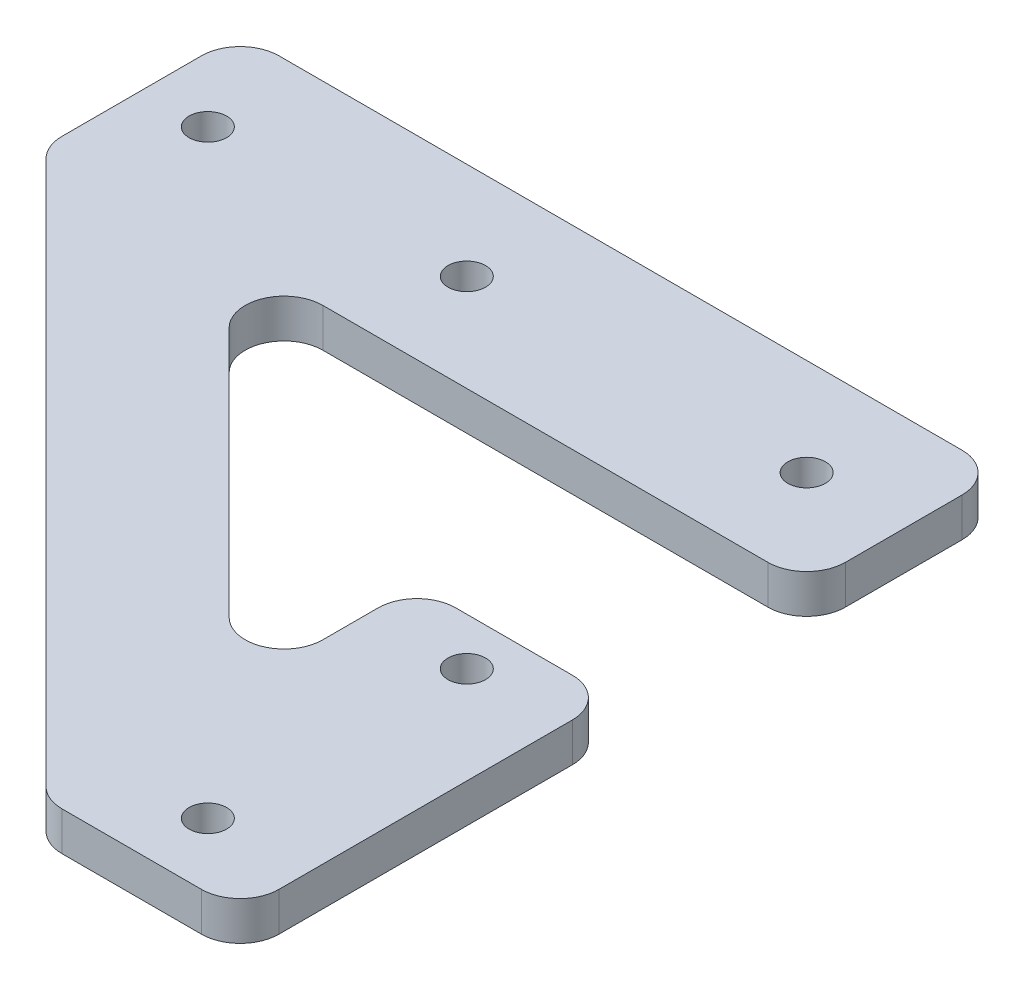
ISO-10303-21;
HEADER;
FILE_DESCRIPTION(('STEP AP214'),'2;1');
FILE_NAME('part.step','',(''),(''),'','','');
FILE_SCHEMA(('AUTOMOTIVE_DESIGN { 1 0 10303 214 1 1 1 1 }'));
ENDSEC;
DATA;
#1=APPLICATION_CONTEXT('core data for automotive mechanical design processes');
#2=APPLICATION_PROTOCOL_DEFINITION('international standard','automotive_design',2000,#1);
#3=PRODUCT_CONTEXT('',#1,'mechanical');
#4=PRODUCT('Part','Part','',(#3));
#5=PRODUCT_RELATED_PRODUCT_CATEGORY('part','',(#4));
#6=PRODUCT_DEFINITION_FORMATION('','',#4);
#7=PRODUCT_DEFINITION_CONTEXT('part definition',#1,'design');
#8=PRODUCT_DEFINITION('design','',#6,#7);
#9=PRODUCT_DEFINITION_SHAPE('','',#8);
#10=(LENGTH_UNIT() NAMED_UNIT(*) SI_UNIT(.MILLI.,.METRE.));
#11=(NAMED_UNIT(*) PLANE_ANGLE_UNIT() SI_UNIT($,.RADIAN.));
#12=(NAMED_UNIT(*) SI_UNIT($,.STERADIAN.) SOLID_ANGLE_UNIT());
#13=UNCERTAINTY_MEASURE_WITH_UNIT(LENGTH_MEASURE(1.E-05),#10,'distance_accuracy_value','');
#14=(GEOMETRIC_REPRESENTATION_CONTEXT(3) GLOBAL_UNCERTAINTY_ASSIGNED_CONTEXT((#13)) GLOBAL_UNIT_ASSIGNED_CONTEXT((#10,
#11,#12)) REPRESENTATION_CONTEXT('',''));
#15=CARTESIAN_POINT('',(0.,0.,0.));
#16=DIRECTION('',(0.,0.,1.));
#17=DIRECTION('',(1.,0.,0.));
#18=AXIS2_PLACEMENT_3D('',#15,#16,#17);
#19=CARTESIAN_POINT('',(0.,3.,0.));
#20=DIRECTION('',(0.,-1.,0.));
#21=DIRECTION('',(0.,0.,-1.));
#22=AXIS2_PLACEMENT_3D('',#19,#20,#21);
#23=PLANE('',#22);
#24=CARTESIAN_POINT('',(-46.25,3.,7.5));
#25=DIRECTION('',(0.,1.,0.));
#26=DIRECTION('',(0.,0.,1.));
#27=AXIS2_PLACEMENT_3D('',#24,#25,#26);
#28=CIRCLE('',#27,1.45);
#29=CARTESIAN_POINT('',(-46.25,3.,8.95));
#30=VERTEX_POINT('',#29);
#31=EDGE_CURVE('E317',#30,#30,#28,.T.);
#32=ORIENTED_EDGE('',*,*,#31,.F.);
#33=EDGE_LOOP('',(#32));
#34=FACE_BOUND('',#33,.T.);
#35=CARTESIAN_POINT('',(-26.25,3.,7.5));
#36=DIRECTION('',(0.,1.,0.));
#37=DIRECTION('',(0.,0.,1.));
#38=AXIS2_PLACEMENT_3D('',#35,#36,#37);
#39=CIRCLE('',#38,1.45);
#40=CARTESIAN_POINT('',(-26.25,3.,8.95));
#41=VERTEX_POINT('',#40);
#42=EDGE_CURVE('E323',#41,#41,#39,.T.);
#43=ORIENTED_EDGE('',*,*,#42,.F.);
#44=EDGE_LOOP('',(#43));
#45=FACE_BOUND('',#44,.T.);
#46=CARTESIAN_POINT('',(0.,3.,53.75));
#47=DIRECTION('',(0.,1.,0.));
#48=DIRECTION('',(0.,0.,1.));
#49=AXIS2_PLACEMENT_3D('',#46,#47,#48);
#50=CIRCLE('',#49,1.45);
#51=CARTESIAN_POINT('',(0.,3.,55.2));
#52=VERTEX_POINT('',#51);
#53=EDGE_CURVE('E329',#52,#52,#50,.T.);
#54=ORIENTED_EDGE('',*,*,#53,.F.);
#55=EDGE_LOOP('',(#54));
#56=FACE_BOUND('',#55,.T.);
#57=CARTESIAN_POINT('',(0.,3.,33.75));
#58=DIRECTION('',(0.,1.,0.));
#59=DIRECTION('',(0.,0.,1.));
#60=AXIS2_PLACEMENT_3D('',#57,#58,#59);
#61=CIRCLE('',#60,1.45);
#62=CARTESIAN_POINT('',(0.,3.,35.2));
#63=VERTEX_POINT('',#62);
#64=EDGE_CURVE('E335',#63,#63,#61,.T.);
#65=ORIENTED_EDGE('',*,*,#64,.F.);
#66=EDGE_LOOP('',(#65));
#67=FACE_BOUND('',#66,.T.);
#68=CARTESIAN_POINT('',(0.,3.,7.5));
#69=DIRECTION('',(0.,1.,0.));
#70=DIRECTION('',(0.,0.,1.));
#71=AXIS2_PLACEMENT_3D('',#68,#69,#70);
#72=CIRCLE('',#71,1.45);
#73=CARTESIAN_POINT('',(0.,3.,8.95));
#74=VERTEX_POINT('',#73);
#75=EDGE_CURVE('E341',#74,#74,#72,.T.);
#76=ORIENTED_EDGE('',*,*,#75,.F.);
#77=EDGE_LOOP('',(#76));
#78=FACE_BOUND('',#77,.T.);
#79=DIRECTION('',(1.,0.,0.));
#80=VECTOR('',#79,1.);
#81=CARTESIAN_POINT('',(-7.5,3.,15.));
#82=LINE('',#81,#80);
#83=CARTESIAN_POINT('',(-29.8652236891498,3.,15.));
#84=VERTEX_POINT('',#83);
#85=CARTESIAN_POINT('',(4.5,3.,15.));
#86=VERTEX_POINT('',#85);
#87=EDGE_CURVE('E179',#84,#86,#82,.T.);
#88=ORIENTED_EDGE('',*,*,#87,.T.);
#89=CARTESIAN_POINT('',(4.5,3.,12.));
#90=DIRECTION('',(0.,-1.,0.));
#91=DIRECTION('',(0.,0.,-1.));
#92=AXIS2_PLACEMENT_3D('',#89,#90,#91);
#93=CIRCLE('',#92,3.);
#94=CARTESIAN_POINT('',(7.5,3.,12.));
#95=VERTEX_POINT('',#94);
#96=EDGE_CURVE('E221',#86,#95,#93,.F.);
#97=ORIENTED_EDGE('',*,*,#96,.T.);
#98=DIRECTION('',(0.,0.,-1.));
#99=VECTOR('',#98,1.);
#100=CARTESIAN_POINT('',(7.5,3.,15.));
#101=LINE('',#100,#99);
#102=CARTESIAN_POINT('',(7.5,3.,3.));
#103=VERTEX_POINT('',#102);
#104=EDGE_CURVE('E353',#95,#103,#101,.T.);
#105=ORIENTED_EDGE('',*,*,#104,.T.);
#106=CARTESIAN_POINT('',(4.5,3.,3.));
#107=DIRECTION('',(0.,-1.,0.));
#108=DIRECTION('',(0.,0.,-1.));
#109=AXIS2_PLACEMENT_3D('',#106,#107,#108);
#110=CIRCLE('',#109,3.);
#111=CARTESIAN_POINT('',(4.5,3.,0.));
#112=VERTEX_POINT('',#111);
#113=EDGE_CURVE('E209',#103,#112,#110,.F.);
#114=ORIENTED_EDGE('',*,*,#113,.T.);
#115=DIRECTION('',(-1.,0.,0.));
#116=VECTOR('',#115,1.);
#117=CARTESIAN_POINT('',(0.,3.,0.));
#118=LINE('',#117,#116);
#119=CARTESIAN_POINT('',(-48.25,3.,0.));
#120=VERTEX_POINT('',#119);
#121=EDGE_CURVE('E197',#112,#120,#118,.T.);
#122=ORIENTED_EDGE('',*,*,#121,.T.);
#123=CARTESIAN_POINT('',(-48.25,3.,3.));
#124=DIRECTION('',(0.,-1.,0.));
#125=DIRECTION('',(0.,0.,-1.));
#126=AXIS2_PLACEMENT_3D('',#123,#124,#125);
#127=CIRCLE('',#126,3.);
#128=CARTESIAN_POINT('',(-51.25,3.,3.));
#129=VERTEX_POINT('',#128);
#130=EDGE_CURVE('E199',#120,#129,#127,.F.);
#131=ORIENTED_EDGE('',*,*,#130,.T.);
#132=DIRECTION('',(0.,0.,1.));
#133=VECTOR('',#132,1.);
#134=CARTESIAN_POINT('',(-51.25,3.,15.));
#135=LINE('',#134,#133);
#136=CARTESIAN_POINT('',(-51.25,3.,13.7573593128807));
#137=VERTEX_POINT('',#136);
#138=EDGE_CURVE('E194',#129,#137,#135,.T.);
#139=ORIENTED_EDGE('',*,*,#138,.T.);
#140=CARTESIAN_POINT('',(-48.25,3.,13.7573593128807));
#141=DIRECTION('',(0.,-1.,0.));
#142=DIRECTION('',(0.,0.,-1.));
#143=AXIS2_PLACEMENT_3D('',#140,#141,#142);
#144=CIRCLE('',#143,3.);
#145=CARTESIAN_POINT('',(-50.3713203435596,3.,15.8786796564404));
#146=VERTEX_POINT('',#145);
#147=EDGE_CURVE('E215',#137,#146,#144,.F.);
#148=ORIENTED_EDGE('',*,*,#147,.T.);
#149=DIRECTION('',(0.707106781186547,0.,0.707106781186547));
#150=VECTOR('',#149,1.);
#151=CARTESIAN_POINT('',(-51.25,3.,15.));
#152=LINE('',#151,#150);
#153=CARTESIAN_POINT('',(-8.37867965644038,3.,57.8713203435596));
#154=VERTEX_POINT('',#153);
#155=EDGE_CURVE('E305',#146,#154,#152,.T.);
#156=ORIENTED_EDGE('',*,*,#155,.T.);
#157=CARTESIAN_POINT('',(-6.25735931288072,3.,55.75));
#158=DIRECTION('',(0.,-1.,0.));
#159=DIRECTION('',(0.,0.,-1.));
#160=AXIS2_PLACEMENT_3D('',#157,#158,#159);
#161=CIRCLE('',#160,3.);
#162=CARTESIAN_POINT('',(-6.25735931288072,3.,58.75));
#163=VERTEX_POINT('',#162);
#164=EDGE_CURVE('E213',#154,#163,#161,.F.);
#165=ORIENTED_EDGE('',*,*,#164,.T.);
#166=DIRECTION('',(1.,0.,0.));
#167=VECTOR('',#166,1.);
#168=CARTESIAN_POINT('',(7.5,3.,58.75));
#169=LINE('',#168,#167);
#170=CARTESIAN_POINT('',(4.5,3.,58.75));
#171=VERTEX_POINT('',#170);
#172=EDGE_CURVE('E350',#163,#171,#169,.T.);
#173=ORIENTED_EDGE('',*,*,#172,.T.);
#174=CARTESIAN_POINT('',(4.5,3.,55.75));
#175=DIRECTION('',(0.,-1.,0.));
#176=DIRECTION('',(0.,0.,-1.));
#177=AXIS2_PLACEMENT_3D('',#174,#175,#176);
#178=CIRCLE('',#177,3.);
#179=CARTESIAN_POINT('',(7.5,3.,55.75));
#180=VERTEX_POINT('',#179);
#181=EDGE_CURVE('E211',#171,#180,#178,.F.);
#182=ORIENTED_EDGE('',*,*,#181,.T.);
#183=CARTESIAN_POINT('',(7.5,3.,33.1));
#184=VERTEX_POINT('',#183);
#185=EDGE_CURVE('E202',#180,#184,#101,.T.);
#186=ORIENTED_EDGE('',*,*,#185,.T.);
#187=CARTESIAN_POINT('',(4.5,3.,33.1));
#188=DIRECTION('',(0.,-1.,0.));
#189=DIRECTION('',(0.,0.,-1.));
#190=AXIS2_PLACEMENT_3D('',#187,#188,#189);
#191=CIRCLE('',#190,3.);
#192=CARTESIAN_POINT('',(4.5,3.,30.1));
#193=VERTEX_POINT('',#192);
#194=EDGE_CURVE('E219',#184,#193,#191,.F.);
#195=ORIENTED_EDGE('',*,*,#194,.T.);
#196=DIRECTION('',(1.,0.,0.));
#197=VECTOR('',#196,1.);
#198=CARTESIAN_POINT('',(-7.5,3.,30.1));
#199=LINE('',#198,#197);
#200=CARTESIAN_POINT('',(-4.5,3.,30.1));
#201=VERTEX_POINT('',#200);
#202=EDGE_CURVE('E422',#201,#193,#199,.T.);
#203=ORIENTED_EDGE('',*,*,#202,.F.);
#204=CARTESIAN_POINT('',(-4.5,3.,33.1));
#205=DIRECTION('',(0.,-1.,0.));
#206=DIRECTION('',(0.,0.,-1.));
#207=AXIS2_PLACEMENT_3D('',#204,#205,#206);
#208=CIRCLE('',#207,3.);
#209=CARTESIAN_POINT('',(-7.5,3.,33.1));
#210=VERTEX_POINT('',#209);
#211=EDGE_CURVE('E217',#201,#210,#208,.F.);
#212=ORIENTED_EDGE('',*,*,#211,.T.);
#213=DIRECTION('',(0.,0.,1.));
#214=VECTOR('',#213,1.);
#215=CARTESIAN_POINT('',(-7.5,3.,58.75));
#216=LINE('',#215,#214);
#217=CARTESIAN_POINT('',(-7.5,3.,37.3652236891498));
#218=VERTEX_POINT('',#217);
#219=EDGE_CURVE('E193',#210,#218,#216,.T.);
#220=ORIENTED_EDGE('',*,*,#219,.T.);
#221=CARTESIAN_POINT('',(-10.5,3.,37.3652236891498));
#222=DIRECTION('',(0.,-1.,0.));
#223=DIRECTION('',(0.,0.,-1.));
#224=AXIS2_PLACEMENT_3D('',#221,#222,#223);
#225=CIRCLE('',#224,3.);
#226=CARTESIAN_POINT('',(-12.6213203435596,3.,39.4865440327094));
#227=VERTEX_POINT('',#226);
#228=EDGE_CURVE('E282',#218,#227,#225,.T.);
#229=ORIENTED_EDGE('',*,*,#228,.T.);
#230=DIRECTION('',(-0.707106781186547,0.,-0.707106781186548));
#231=VECTOR('',#230,1.);
#232=CARTESIAN_POINT('',(-7.5,3.,44.6078643762691));
#233=LINE('',#232,#231);
#234=CARTESIAN_POINT('',(-31.9865440327094,3.,20.1213203435596));
#235=VERTEX_POINT('',#234);
#236=EDGE_CURVE('E180',#227,#235,#233,.T.);
#237=ORIENTED_EDGE('',*,*,#236,.T.);
#238=CARTESIAN_POINT('',(-29.8652236891498,3.,18.));
#239=DIRECTION('',(0.,-1.,0.));
#240=DIRECTION('',(0.,0.,-1.));
#241=AXIS2_PLACEMENT_3D('',#238,#239,#240);
#242=CIRCLE('',#241,3.);
#243=EDGE_CURVE('E49',#235,#84,#242,.T.);
#244=ORIENTED_EDGE('',*,*,#243,.T.);
#245=EDGE_LOOP('',(#88,#97,#105,#114,#122,#131,#139,#148,#156,#165,#173,#182,#186,#195,#203,
#212,#220,#229,#237,#244));
#246=FACE_BOUND('',#245,.T.);
#247=ADVANCED_FACE('F41',(#34,#45,#56,#67,#78,#246),#23,.F.);
#248=CARTESIAN_POINT('',(0.,0.,0.));
#249=DIRECTION('',(0.,-1.,0.));
#250=DIRECTION('',(0.,0.,-1.));
#251=AXIS2_PLACEMENT_3D('',#248,#249,#250);
#252=PLANE('',#251);
#253=CARTESIAN_POINT('',(-26.25,0.,7.5));
#254=DIRECTION('',(0.,1.,0.));
#255=DIRECTION('',(0.,0.,1.));
#256=AXIS2_PLACEMENT_3D('',#253,#254,#255);
#257=CIRCLE('',#256,1.45);
#258=CARTESIAN_POINT('',(-26.25,0.,8.95));
#259=VERTEX_POINT('',#258);
#260=EDGE_CURVE('E320',#259,#259,#257,.T.);
#261=ORIENTED_EDGE('',*,*,#260,.T.);
#262=EDGE_LOOP('',(#261));
#263=FACE_BOUND('',#262,.T.);
#264=CARTESIAN_POINT('',(0.,0.,33.75));
#265=DIRECTION('',(0.,1.,0.));
#266=DIRECTION('',(0.,0.,1.));
#267=AXIS2_PLACEMENT_3D('',#264,#265,#266);
#268=CIRCLE('',#267,1.45);
#269=CARTESIAN_POINT('',(0.,0.,35.2));
#270=VERTEX_POINT('',#269);
#271=EDGE_CURVE('E332',#270,#270,#268,.T.);
#272=ORIENTED_EDGE('',*,*,#271,.T.);
#273=EDGE_LOOP('',(#272));
#274=FACE_BOUND('',#273,.T.);
#275=CARTESIAN_POINT('',(0.,0.,7.5));
#276=DIRECTION('',(0.,1.,0.));
#277=DIRECTION('',(0.,0.,1.));
#278=AXIS2_PLACEMENT_3D('',#275,#276,#277);
#279=CIRCLE('',#278,1.45);
#280=CARTESIAN_POINT('',(0.,0.,8.95));
#281=VERTEX_POINT('',#280);
#282=EDGE_CURVE('E338',#281,#281,#279,.T.);
#283=ORIENTED_EDGE('',*,*,#282,.T.);
#284=EDGE_LOOP('',(#283));
#285=FACE_BOUND('',#284,.T.);
#286=CARTESIAN_POINT('',(0.,0.,53.75));
#287=DIRECTION('',(0.,1.,0.));
#288=DIRECTION('',(0.,0.,1.));
#289=AXIS2_PLACEMENT_3D('',#286,#287,#288);
#290=CIRCLE('',#289,1.45);
#291=CARTESIAN_POINT('',(0.,0.,55.2));
#292=VERTEX_POINT('',#291);
#293=EDGE_CURVE('E326',#292,#292,#290,.T.);
#294=ORIENTED_EDGE('',*,*,#293,.T.);
#295=EDGE_LOOP('',(#294));
#296=FACE_BOUND('',#295,.T.);
#297=CARTESIAN_POINT('',(-46.25,0.,7.5));
#298=DIRECTION('',(0.,1.,0.));
#299=DIRECTION('',(0.,0.,1.));
#300=AXIS2_PLACEMENT_3D('',#297,#298,#299);
#301=CIRCLE('',#300,1.45);
#302=CARTESIAN_POINT('',(-46.25,0.,8.95));
#303=VERTEX_POINT('',#302);
#304=EDGE_CURVE('E316',#303,#303,#301,.T.);
#305=ORIENTED_EDGE('',*,*,#304,.T.);
#306=EDGE_LOOP('',(#305));
#307=FACE_BOUND('',#306,.T.);
#308=DIRECTION('',(0.,0.,-1.));
#309=VECTOR('',#308,1.);
#310=CARTESIAN_POINT('',(7.5,0.,15.));
#311=LINE('',#310,#309);
#312=CARTESIAN_POINT('',(7.5,0.,12.));
#313=VERTEX_POINT('',#312);
#314=CARTESIAN_POINT('',(7.5,0.,3.));
#315=VERTEX_POINT('',#314);
#316=EDGE_CURVE('E360',#313,#315,#311,.T.);
#317=ORIENTED_EDGE('',*,*,#316,.F.);
#318=CARTESIAN_POINT('',(4.5,0.,12.));
#319=DIRECTION('',(0.,-1.,0.));
#320=DIRECTION('',(0.,0.,-1.));
#321=AXIS2_PLACEMENT_3D('',#318,#319,#320);
#322=CIRCLE('',#321,3.);
#323=CARTESIAN_POINT('',(4.5,0.,15.));
#324=VERTEX_POINT('',#323);
#325=EDGE_CURVE('E242',#313,#324,#322,.T.);
#326=ORIENTED_EDGE('',*,*,#325,.T.);
#327=DIRECTION('',(1.,0.,0.));
#328=VECTOR('',#327,1.);
#329=CARTESIAN_POINT('',(-7.5,0.,15.));
#330=LINE('',#329,#328);
#331=CARTESIAN_POINT('',(-29.8652236891498,0.,15.));
#332=VERTEX_POINT('',#331);
#333=EDGE_CURVE('E300',#332,#324,#330,.T.);
#334=ORIENTED_EDGE('',*,*,#333,.F.);
#335=CARTESIAN_POINT('',(-29.8652236891498,0.,18.));
#336=DIRECTION('',(0.,-1.,0.));
#337=DIRECTION('',(0.,0.,-1.));
#338=AXIS2_PLACEMENT_3D('',#335,#336,#337);
#339=CIRCLE('',#338,3.);
#340=CARTESIAN_POINT('',(-31.9865440327094,0.,20.1213203435596));
#341=VERTEX_POINT('',#340);
#342=EDGE_CURVE('E11',#332,#341,#339,.F.);
#343=ORIENTED_EDGE('',*,*,#342,.T.);
#344=DIRECTION('',(-0.707106781186547,0.,-0.707106781186548));
#345=VECTOR('',#344,1.);
#346=CARTESIAN_POINT('',(-7.5,0.,44.6078643762691));
#347=LINE('',#346,#345);
#348=CARTESIAN_POINT('',(-12.6213203435596,0.,39.4865440327094));
#349=VERTEX_POINT('',#348);
#350=EDGE_CURVE('E291',#349,#341,#347,.T.);
#351=ORIENTED_EDGE('',*,*,#350,.F.);
#352=CARTESIAN_POINT('',(-10.5,0.,37.3652236891498));
#353=DIRECTION('',(0.,-1.,0.));
#354=DIRECTION('',(0.,0.,-1.));
#355=AXIS2_PLACEMENT_3D('',#352,#353,#354);
#356=CIRCLE('',#355,3.);
#357=CARTESIAN_POINT('',(-7.5,0.,37.3652236891498));
#358=VERTEX_POINT('',#357);
#359=EDGE_CURVE('E185',#349,#358,#356,.F.);
#360=ORIENTED_EDGE('',*,*,#359,.T.);
#361=DIRECTION('',(0.,0.,1.));
#362=VECTOR('',#361,1.);
#363=CARTESIAN_POINT('',(-7.5,0.,58.75));
#364=LINE('',#363,#362);
#365=CARTESIAN_POINT('',(-7.5,0.,33.1));
#366=VERTEX_POINT('',#365);
#367=EDGE_CURVE('E289',#366,#358,#364,.T.);
#368=ORIENTED_EDGE('',*,*,#367,.F.);
#369=CARTESIAN_POINT('',(-4.5,0.,33.1));
#370=DIRECTION('',(0.,-1.,0.));
#371=DIRECTION('',(0.,0.,-1.));
#372=AXIS2_PLACEMENT_3D('',#369,#370,#371);
#373=CIRCLE('',#372,3.);
#374=CARTESIAN_POINT('',(-4.5,0.,30.1));
#375=VERTEX_POINT('',#374);
#376=EDGE_CURVE('E238',#366,#375,#373,.T.);
#377=ORIENTED_EDGE('',*,*,#376,.T.);
#378=DIRECTION('',(-1.,0.,0.));
#379=VECTOR('',#378,1.);
#380=CARTESIAN_POINT('',(7.50000000000001,0.,30.1));
#381=LINE('',#380,#379);
#382=CARTESIAN_POINT('',(4.5,0.,30.1));
#383=VERTEX_POINT('',#382);
#384=EDGE_CURVE('E310',#383,#375,#381,.T.);
#385=ORIENTED_EDGE('',*,*,#384,.F.);
#386=CARTESIAN_POINT('',(4.5,0.,33.1));
#387=DIRECTION('',(0.,-1.,0.));
#388=DIRECTION('',(0.,0.,-1.));
#389=AXIS2_PLACEMENT_3D('',#386,#387,#388);
#390=CIRCLE('',#389,3.);
#391=CARTESIAN_POINT('',(7.5,0.,33.1));
#392=VERTEX_POINT('',#391);
#393=EDGE_CURVE('E240',#383,#392,#390,.T.);
#394=ORIENTED_EDGE('',*,*,#393,.T.);
#395=CARTESIAN_POINT('',(7.5,0.,55.75));
#396=VERTEX_POINT('',#395);
#397=EDGE_CURVE('E361',#396,#392,#311,.T.);
#398=ORIENTED_EDGE('',*,*,#397,.F.);
#399=CARTESIAN_POINT('',(4.5,0.,55.75));
#400=DIRECTION('',(0.,-1.,0.));
#401=DIRECTION('',(0.,0.,-1.));
#402=AXIS2_PLACEMENT_3D('',#399,#400,#401);
#403=CIRCLE('',#402,3.);
#404=CARTESIAN_POINT('',(4.5,0.,58.75));
#405=VERTEX_POINT('',#404);
#406=EDGE_CURVE('E232',#396,#405,#403,.T.);
#407=ORIENTED_EDGE('',*,*,#406,.T.);
#408=DIRECTION('',(1.,0.,0.));
#409=VECTOR('',#408,1.);
#410=CARTESIAN_POINT('',(7.5,0.,58.75));
#411=LINE('',#410,#409);
#412=CARTESIAN_POINT('',(-6.25735931288072,0.,58.75));
#413=VERTEX_POINT('',#412);
#414=EDGE_CURVE('E299',#413,#405,#411,.T.);
#415=ORIENTED_EDGE('',*,*,#414,.F.);
#416=CARTESIAN_POINT('',(-6.25735931288072,0.,55.75));
#417=DIRECTION('',(0.,-1.,0.));
#418=DIRECTION('',(0.,0.,-1.));
#419=AXIS2_PLACEMENT_3D('',#416,#417,#418);
#420=CIRCLE('',#419,3.);
#421=CARTESIAN_POINT('',(-8.37867965644037,0.,57.8713203435596));
#422=VERTEX_POINT('',#421);
#423=EDGE_CURVE('E234',#413,#422,#420,.T.);
#424=ORIENTED_EDGE('',*,*,#423,.T.);
#425=DIRECTION('',(0.707106781186547,0.,0.707106781186548));
#426=VECTOR('',#425,1.);
#427=CARTESIAN_POINT('',(-51.25,0.,15.));
#428=LINE('',#427,#426);
#429=CARTESIAN_POINT('',(-50.3713203435596,0.,15.8786796564404));
#430=VERTEX_POINT('',#429);
#431=EDGE_CURVE('E304',#430,#422,#428,.T.);
#432=ORIENTED_EDGE('',*,*,#431,.F.);
#433=CARTESIAN_POINT('',(-48.25,0.,13.7573593128807));
#434=DIRECTION('',(0.,-1.,0.));
#435=DIRECTION('',(0.,0.,-1.));
#436=AXIS2_PLACEMENT_3D('',#433,#434,#435);
#437=CIRCLE('',#436,3.);
#438=CARTESIAN_POINT('',(-51.25,0.,13.7573593128807));
#439=VERTEX_POINT('',#438);
#440=EDGE_CURVE('E236',#430,#439,#437,.T.);
#441=ORIENTED_EDGE('',*,*,#440,.T.);
#442=DIRECTION('',(0.,0.,1.));
#443=VECTOR('',#442,1.);
#444=CARTESIAN_POINT('',(-51.25,0.,15.));
#445=LINE('',#444,#443);
#446=CARTESIAN_POINT('',(-51.25,0.,3.));
#447=VERTEX_POINT('',#446);
#448=EDGE_CURVE('E344',#447,#439,#445,.T.);
#449=ORIENTED_EDGE('',*,*,#448,.F.);
#450=CARTESIAN_POINT('',(-48.25,0.,3.));
#451=DIRECTION('',(0.,-1.,0.));
#452=DIRECTION('',(0.,0.,-1.));
#453=AXIS2_PLACEMENT_3D('',#450,#451,#452);
#454=CIRCLE('',#453,3.);
#455=CARTESIAN_POINT('',(-48.25,0.,0.));
#456=VERTEX_POINT('',#455);
#457=EDGE_CURVE('E228',#447,#456,#454,.T.);
#458=ORIENTED_EDGE('',*,*,#457,.T.);
#459=DIRECTION('',(-1.,0.,0.));
#460=VECTOR('',#459,1.);
#461=CARTESIAN_POINT('',(-51.25,0.,0.));
#462=LINE('',#461,#460);
#463=CARTESIAN_POINT('',(4.49999999999998,0.,0.));
#464=VERTEX_POINT('',#463);
#465=EDGE_CURVE('E205',#464,#456,#462,.T.);
#466=ORIENTED_EDGE('',*,*,#465,.F.);
#467=CARTESIAN_POINT('',(4.5,0.,3.));
#468=DIRECTION('',(0.,-1.,0.));
#469=DIRECTION('',(0.,0.,-1.));
#470=AXIS2_PLACEMENT_3D('',#467,#468,#469);
#471=CIRCLE('',#470,3.);
#472=EDGE_CURVE('E230',#464,#315,#471,.T.);
#473=ORIENTED_EDGE('',*,*,#472,.T.);
#474=EDGE_LOOP('',(#317,#326,#334,#343,#351,#360,#368,#377,#385,#394,#398,#407,#415,#424,#432,
#441,#449,#458,#466,#473));
#475=FACE_BOUND('',#474,.T.);
#476=ADVANCED_FACE('F288',(#263,#274,#285,#296,#307,#475),#252,.T.);
#477=CARTESIAN_POINT('',(-7.5,3.,58.75));
#478=DIRECTION('',(1.,0.,0.));
#479=DIRECTION('',(0.,0.,-1.));
#480=AXIS2_PLACEMENT_3D('',#477,#478,#479);
#481=PLANE('',#480);
#482=ORIENTED_EDGE('',*,*,#219,.F.);
#483=DIRECTION('',(0.,1.,0.));
#484=VECTOR('',#483,1.);
#485=CARTESIAN_POINT('',(-7.5,0.,33.1));
#486=LINE('',#485,#484);
#487=EDGE_CURVE('E258',#210,#366,#486,.F.);
#488=ORIENTED_EDGE('',*,*,#487,.T.);
#489=ORIENTED_EDGE('',*,*,#367,.T.);
#490=DIRECTION('',(0.,1.,0.));
#491=VECTOR('',#490,1.);
#492=CARTESIAN_POINT('',(-7.5,3.,37.3652236891498));
#493=LINE('',#492,#491);
#494=EDGE_CURVE('E255',#358,#218,#493,.T.);
#495=ORIENTED_EDGE('',*,*,#494,.T.);
#496=EDGE_LOOP('',(#482,#488,#489,#495));
#497=FACE_BOUND('',#496,.T.);
#498=ADVANCED_FACE('F296',(#497),#481,.F.);
#499=CARTESIAN_POINT('',(7.5,3.,15.));
#500=DIRECTION('',(-1.,0.,0.));
#501=DIRECTION('',(0.,0.,1.));
#502=AXIS2_PLACEMENT_3D('',#499,#500,#501);
#503=PLANE('',#502);
#504=ORIENTED_EDGE('',*,*,#397,.T.);
#505=DIRECTION('',(0.,-1.,0.));
#506=VECTOR('',#505,1.);
#507=CARTESIAN_POINT('',(7.5,3.,33.1));
#508=LINE('',#507,#506);
#509=EDGE_CURVE('E253',#392,#184,#508,.F.);
#510=ORIENTED_EDGE('',*,*,#509,.T.);
#511=ORIENTED_EDGE('',*,*,#185,.F.);
#512=DIRECTION('',(0.,-1.,0.));
#513=VECTOR('',#512,1.);
#514=CARTESIAN_POINT('',(7.5,3.,55.75));
#515=LINE('',#514,#513);
#516=EDGE_CURVE('E250',#180,#396,#515,.T.);
#517=ORIENTED_EDGE('',*,*,#516,.T.);
#518=EDGE_LOOP('',(#504,#510,#511,#517));
#519=FACE_BOUND('',#518,.T.);
#520=ADVANCED_FACE('F416',(#519),#503,.F.);
#521=ORIENTED_EDGE('',*,*,#104,.F.);
#522=DIRECTION('',(0.,1.,0.));
#523=VECTOR('',#522,1.);
#524=CARTESIAN_POINT('',(7.5,3.,12.));
#525=LINE('',#524,#523);
#526=EDGE_CURVE('E226',#95,#313,#525,.F.);
#527=ORIENTED_EDGE('',*,*,#526,.T.);
#528=ORIENTED_EDGE('',*,*,#316,.T.);
#529=DIRECTION('',(0.,1.,0.));
#530=VECTOR('',#529,1.);
#531=CARTESIAN_POINT('',(7.5,3.,3.));
#532=LINE('',#531,#530);
#533=EDGE_CURVE('E223',#315,#103,#532,.T.);
#534=ORIENTED_EDGE('',*,*,#533,.T.);
#535=EDGE_LOOP('',(#521,#527,#528,#534));
#536=FACE_BOUND('',#535,.T.);
#537=ADVANCED_FACE('F371',(#536),#503,.F.);
#538=CARTESIAN_POINT('',(-51.25,3.,15.));
#539=DIRECTION('',(1.,0.,0.));
#540=DIRECTION('',(0.,0.,-1.));
#541=AXIS2_PLACEMENT_3D('',#538,#539,#540);
#542=PLANE('',#541);
#543=ORIENTED_EDGE('',*,*,#448,.T.);
#544=DIRECTION('',(0.,-1.,0.));
#545=VECTOR('',#544,1.);
#546=CARTESIAN_POINT('',(-51.25,3.,13.7573593128807));
#547=LINE('',#546,#545);
#548=EDGE_CURVE('E271',#439,#137,#547,.F.);
#549=ORIENTED_EDGE('',*,*,#548,.T.);
#550=ORIENTED_EDGE('',*,*,#138,.F.);
#551=DIRECTION('',(0.,-1.,0.));
#552=VECTOR('',#551,1.);
#553=CARTESIAN_POINT('',(-51.25,3.,3.));
#554=LINE('',#553,#552);
#555=EDGE_CURVE('E268',#129,#447,#554,.T.);
#556=ORIENTED_EDGE('',*,*,#555,.T.);
#557=EDGE_LOOP('',(#543,#549,#550,#556));
#558=FACE_BOUND('',#557,.T.);
#559=ADVANCED_FACE('F390',(#558),#542,.F.);
#560=CARTESIAN_POINT('',(-7.5,3.,15.));
#561=DIRECTION('',(0.,0.,-1.));
#562=DIRECTION('',(-1.,0.,0.));
#563=AXIS2_PLACEMENT_3D('',#560,#561,#562);
#564=PLANE('',#563);
#565=ORIENTED_EDGE('',*,*,#333,.T.);
#566=DIRECTION('',(0.,1.,0.));
#567=VECTOR('',#566,1.);
#568=CARTESIAN_POINT('',(4.5,3.,15.));
#569=LINE('',#568,#567);
#570=EDGE_CURVE('E192',#324,#86,#569,.T.);
#571=ORIENTED_EDGE('',*,*,#570,.T.);
#572=ORIENTED_EDGE('',*,*,#87,.F.);
#573=DIRECTION('',(0.,1.,0.));
#574=VECTOR('',#573,1.);
#575=CARTESIAN_POINT('',(-29.8652236891498,3.,15.));
#576=LINE('',#575,#574);
#577=EDGE_CURVE('E190',#84,#332,#576,.F.);
#578=ORIENTED_EDGE('',*,*,#577,.T.);
#579=EDGE_LOOP('',(#565,#571,#572,#578));
#580=FACE_BOUND('',#579,.T.);
#581=ADVANCED_FACE('F189',(#580),#564,.F.);
#582=CARTESIAN_POINT('',(7.5,3.,58.75));
#583=DIRECTION('',(0.,0.,-1.));
#584=DIRECTION('',(-1.,0.,0.));
#585=AXIS2_PLACEMENT_3D('',#582,#583,#584);
#586=PLANE('',#585);
#587=ORIENTED_EDGE('',*,*,#172,.F.);
#588=DIRECTION('',(0.,-1.,0.));
#589=VECTOR('',#588,1.);
#590=CARTESIAN_POINT('',(-6.25735931288072,0.,58.75));
#591=LINE('',#590,#589);
#592=EDGE_CURVE('E275',#163,#413,#591,.T.);
#593=ORIENTED_EDGE('',*,*,#592,.T.);
#594=ORIENTED_EDGE('',*,*,#414,.T.);
#595=DIRECTION('',(0.,-1.,0.));
#596=VECTOR('',#595,1.);
#597=CARTESIAN_POINT('',(4.5,3.,58.75));
#598=LINE('',#597,#596);
#599=EDGE_CURVE('E273',#405,#171,#598,.F.);
#600=ORIENTED_EDGE('',*,*,#599,.T.);
#601=EDGE_LOOP('',(#587,#593,#594,#600));
#602=FACE_BOUND('',#601,.T.);
#603=ADVANCED_FACE('F408',(#602),#586,.F.);
#604=CARTESIAN_POINT('',(-51.25,3.,0.));
#605=DIRECTION('',(0.,0.,1.));
#606=DIRECTION('',(1.,0.,0.));
#607=AXIS2_PLACEMENT_3D('',#604,#605,#606);
#608=PLANE('',#607);
#609=ORIENTED_EDGE('',*,*,#121,.F.);
#610=DIRECTION('',(0.,1.,0.));
#611=VECTOR('',#610,1.);
#612=CARTESIAN_POINT('',(4.5,3.,0.));
#613=LINE('',#612,#611);
#614=EDGE_CURVE('E280',#112,#464,#613,.F.);
#615=ORIENTED_EDGE('',*,*,#614,.T.);
#616=ORIENTED_EDGE('',*,*,#465,.T.);
#617=DIRECTION('',(0.,-1.,0.));
#618=VECTOR('',#617,1.);
#619=CARTESIAN_POINT('',(-48.25,3.,0.));
#620=LINE('',#619,#618);
#621=EDGE_CURVE('E278',#456,#120,#620,.F.);
#622=ORIENTED_EDGE('',*,*,#621,.T.);
#623=EDGE_LOOP('',(#609,#615,#616,#622));
#624=FACE_BOUND('',#623,.T.);
#625=ADVANCED_FACE('F382',(#624),#608,.F.);
#626=CARTESIAN_POINT('',(0.,3.,7.5));
#627=DIRECTION('',(0.,-1.,0.));
#628=DIRECTION('',(0.,0.,-1.));
#629=AXIS2_PLACEMENT_3D('',#626,#627,#628);
#630=CYLINDRICAL_SURFACE('',#629,1.45);
#631=ORIENTED_EDGE('',*,*,#75,.T.);
#632=EDGE_LOOP('',(#631));
#633=FACE_BOUND('',#632,.T.);
#634=ORIENTED_EDGE('',*,*,#282,.F.);
#635=EDGE_LOOP('',(#634));
#636=FACE_BOUND('',#635,.T.);
#637=ADVANCED_FACE('F451',(#633,#636),#630,.F.);
#638=CARTESIAN_POINT('',(0.,3.,33.75));
#639=DIRECTION('',(0.,-1.,0.));
#640=DIRECTION('',(0.,0.,-1.));
#641=AXIS2_PLACEMENT_3D('',#638,#639,#640);
#642=CYLINDRICAL_SURFACE('',#641,1.45);
#643=ORIENTED_EDGE('',*,*,#64,.T.);
#644=EDGE_LOOP('',(#643));
#645=FACE_BOUND('',#644,.T.);
#646=ORIENTED_EDGE('',*,*,#271,.F.);
#647=EDGE_LOOP('',(#646));
#648=FACE_BOUND('',#647,.T.);
#649=ADVANCED_FACE('F488',(#645,#648),#642,.F.);
#650=CARTESIAN_POINT('',(0.,3.,53.75));
#651=DIRECTION('',(0.,-1.,0.));
#652=DIRECTION('',(0.,0.,-1.));
#653=AXIS2_PLACEMENT_3D('',#650,#651,#652);
#654=CYLINDRICAL_SURFACE('',#653,1.45);
#655=ORIENTED_EDGE('',*,*,#53,.T.);
#656=EDGE_LOOP('',(#655));
#657=FACE_BOUND('',#656,.T.);
#658=ORIENTED_EDGE('',*,*,#293,.F.);
#659=EDGE_LOOP('',(#658));
#660=FACE_BOUND('',#659,.T.);
#661=ADVANCED_FACE('F485',(#657,#660),#654,.F.);
#662=CARTESIAN_POINT('',(-26.25,3.,7.5));
#663=DIRECTION('',(0.,-1.,0.));
#664=DIRECTION('',(0.,0.,-1.));
#665=AXIS2_PLACEMENT_3D('',#662,#663,#664);
#666=CYLINDRICAL_SURFACE('',#665,1.45);
#667=ORIENTED_EDGE('',*,*,#42,.T.);
#668=EDGE_LOOP('',(#667));
#669=FACE_BOUND('',#668,.T.);
#670=ORIENTED_EDGE('',*,*,#260,.F.);
#671=EDGE_LOOP('',(#670));
#672=FACE_BOUND('',#671,.T.);
#673=ADVANCED_FACE('F481',(#669,#672),#666,.F.);
#674=CARTESIAN_POINT('',(-46.25,3.,7.5));
#675=DIRECTION('',(0.,-1.,0.));
#676=DIRECTION('',(0.,0.,-1.));
#677=AXIS2_PLACEMENT_3D('',#674,#675,#676);
#678=CYLINDRICAL_SURFACE('',#677,1.45);
#679=ORIENTED_EDGE('',*,*,#31,.T.);
#680=EDGE_LOOP('',(#679));
#681=FACE_BOUND('',#680,.T.);
#682=ORIENTED_EDGE('',*,*,#304,.F.);
#683=EDGE_LOOP('',(#682));
#684=FACE_BOUND('',#683,.T.);
#685=ADVANCED_FACE('F479',(#681,#684),#678,.F.);
#686=CARTESIAN_POINT('',(-51.25,-61.8718433538229,15.));
#687=DIRECTION('',(-0.707106781186548,0.,0.707106781186547));
#688=DIRECTION('',(0.707106781186547,0.,0.707106781186548));
#689=AXIS2_PLACEMENT_3D('',#686,#687,#688);
#690=PLANE('',#689);
#691=ORIENTED_EDGE('',*,*,#155,.F.);
#692=DIRECTION('',(0.,-1.,0.));
#693=VECTOR('',#692,1.);
#694=CARTESIAN_POINT('',(-50.3713203435596,0.,15.8786796564404));
#695=LINE('',#694,#693);
#696=EDGE_CURVE('E265',#146,#430,#695,.T.);
#697=ORIENTED_EDGE('',*,*,#696,.T.);
#698=ORIENTED_EDGE('',*,*,#431,.T.);
#699=DIRECTION('',(0.,-1.,0.));
#700=VECTOR('',#699,1.);
#701=CARTESIAN_POINT('',(-8.37867965644036,3.,57.8713203435596));
#702=LINE('',#701,#700);
#703=EDGE_CURVE('E263',#422,#154,#702,.F.);
#704=ORIENTED_EDGE('',*,*,#703,.T.);
#705=EDGE_LOOP('',(#691,#697,#698,#704));
#706=FACE_BOUND('',#705,.T.);
#707=ADVANCED_FACE('F399',(#706),#690,.T.);
#708=CARTESIAN_POINT('',(-7.5,-61.8718433538229,44.6078643762691));
#709=DIRECTION('',(0.707106781186548,0.,-0.707106781186547));
#710=DIRECTION('',(-0.707106781186547,0.,-0.707106781186548));
#711=AXIS2_PLACEMENT_3D('',#708,#709,#710);
#712=PLANE('',#711);
#713=ORIENTED_EDGE('',*,*,#236,.F.);
#714=DIRECTION('',(0.,1.,0.));
#715=VECTOR('',#714,1.);
#716=CARTESIAN_POINT('',(-12.6213203435596,-61.8718433538229,39.4865440327094));
#717=LINE('',#716,#715);
#718=EDGE_CURVE('E61',#227,#349,#717,.F.);
#719=ORIENTED_EDGE('',*,*,#718,.T.);
#720=ORIENTED_EDGE('',*,*,#350,.T.);
#721=DIRECTION('',(0.,1.,0.));
#722=VECTOR('',#721,1.);
#723=CARTESIAN_POINT('',(-31.9865440327094,-61.8718433538229,20.1213203435596));
#724=LINE('',#723,#722);
#725=EDGE_CURVE('E260',#341,#235,#724,.T.);
#726=ORIENTED_EDGE('',*,*,#725,.T.);
#727=EDGE_LOOP('',(#713,#719,#720,#726));
#728=FACE_BOUND('',#727,.T.);
#729=ADVANCED_FACE('F303',(#728),#712,.T.);
#730=CARTESIAN_POINT('',(0.,0.,30.1));
#731=DIRECTION('',(0.,0.,-1.));
#732=DIRECTION('',(-1.,0.,0.));
#733=AXIS2_PLACEMENT_3D('',#730,#731,#732);
#734=PLANE('',#733);
#735=ORIENTED_EDGE('',*,*,#202,.T.);
#736=DIRECTION('',(0.,-1.,0.));
#737=VECTOR('',#736,1.);
#738=CARTESIAN_POINT('',(4.5,0.,30.1));
#739=LINE('',#738,#737);
#740=EDGE_CURVE('E247',#193,#383,#739,.T.);
#741=ORIENTED_EDGE('',*,*,#740,.T.);
#742=ORIENTED_EDGE('',*,*,#384,.T.);
#743=DIRECTION('',(0.,1.,0.));
#744=VECTOR('',#743,1.);
#745=CARTESIAN_POINT('',(-4.5,3.,30.1));
#746=LINE('',#745,#744);
#747=EDGE_CURVE('E244',#375,#201,#746,.T.);
#748=ORIENTED_EDGE('',*,*,#747,.T.);
#749=EDGE_LOOP('',(#735,#741,#742,#748));
#750=FACE_BOUND('',#749,.T.);
#751=ADVANCED_FACE('F424',(#750),#734,.T.);
#752=CARTESIAN_POINT('',(4.5,3.,12.));
#753=DIRECTION('',(0.,1.,0.));
#754=DIRECTION('',(0.,0.,1.));
#755=AXIS2_PLACEMENT_3D('',#752,#753,#754);
#756=CYLINDRICAL_SURFACE('',#755,3.);
#757=ORIENTED_EDGE('',*,*,#325,.F.);
#758=ORIENTED_EDGE('',*,*,#526,.F.);
#759=ORIENTED_EDGE('',*,*,#96,.F.);
#760=ORIENTED_EDGE('',*,*,#570,.F.);
#761=EDGE_LOOP('',(#757,#758,#759,#760));
#762=FACE_BOUND('',#761,.T.);
#763=ADVANCED_FACE('F437',(#762),#756,.T.);
#764=CARTESIAN_POINT('',(4.5,0.,33.1));
#765=DIRECTION('',(0.,1.,0.));
#766=DIRECTION('',(0.,0.,1.));
#767=AXIS2_PLACEMENT_3D('',#764,#765,#766);
#768=CYLINDRICAL_SURFACE('',#767,3.);
#769=ORIENTED_EDGE('',*,*,#194,.F.);
#770=ORIENTED_EDGE('',*,*,#509,.F.);
#771=ORIENTED_EDGE('',*,*,#393,.F.);
#772=ORIENTED_EDGE('',*,*,#740,.F.);
#773=EDGE_LOOP('',(#769,#770,#771,#772));
#774=FACE_BOUND('',#773,.T.);
#775=ADVANCED_FACE('F418',(#774),#768,.T.);
#776=CARTESIAN_POINT('',(-4.5,0.,33.1));
#777=DIRECTION('',(0.,-1.,0.));
#778=DIRECTION('',(0.,0.,-1.));
#779=AXIS2_PLACEMENT_3D('',#776,#777,#778);
#780=CYLINDRICAL_SURFACE('',#779,3.);
#781=ORIENTED_EDGE('',*,*,#376,.F.);
#782=ORIENTED_EDGE('',*,*,#487,.F.);
#783=ORIENTED_EDGE('',*,*,#211,.F.);
#784=ORIENTED_EDGE('',*,*,#747,.F.);
#785=EDGE_LOOP('',(#781,#782,#783,#784));
#786=FACE_BOUND('',#785,.T.);
#787=ADVANCED_FACE('F429',(#786),#780,.T.);
#788=CARTESIAN_POINT('',(-10.5,3.,37.3652236891498));
#789=DIRECTION('',(0.,1.,0.));
#790=DIRECTION('',(0.,0.,1.));
#791=AXIS2_PLACEMENT_3D('',#788,#789,#790);
#792=CYLINDRICAL_SURFACE('',#791,3.);
#793=ORIENTED_EDGE('',*,*,#359,.F.);
#794=ORIENTED_EDGE('',*,*,#718,.F.);
#795=ORIENTED_EDGE('',*,*,#228,.F.);
#796=ORIENTED_EDGE('',*,*,#494,.F.);
#797=EDGE_LOOP('',(#793,#794,#795,#796));
#798=FACE_BOUND('',#797,.T.);
#799=ADVANCED_FACE('F302',(#798),#792,.F.);
#800=CARTESIAN_POINT('',(-29.8652236891498,-61.8718433538229,18.));
#801=DIRECTION('',(0.,1.,0.));
#802=DIRECTION('',(0.,0.,1.));
#803=AXIS2_PLACEMENT_3D('',#800,#801,#802);
#804=CYLINDRICAL_SURFACE('',#803,3.);
#805=ORIENTED_EDGE('',*,*,#342,.F.);
#806=ORIENTED_EDGE('',*,*,#577,.F.);
#807=ORIENTED_EDGE('',*,*,#243,.F.);
#808=ORIENTED_EDGE('',*,*,#725,.F.);
#809=EDGE_LOOP('',(#805,#806,#807,#808));
#810=FACE_BOUND('',#809,.T.);
#811=ADVANCED_FACE('F196',(#810),#804,.F.);
#812=CARTESIAN_POINT('',(-48.25,-61.8718433538229,13.7573593128807));
#813=DIRECTION('',(0.,1.,0.));
#814=DIRECTION('',(0.,0.,1.));
#815=AXIS2_PLACEMENT_3D('',#812,#813,#814);
#816=CYLINDRICAL_SURFACE('',#815,3.);
#817=ORIENTED_EDGE('',*,*,#147,.F.);
#818=ORIENTED_EDGE('',*,*,#548,.F.);
#819=ORIENTED_EDGE('',*,*,#440,.F.);
#820=ORIENTED_EDGE('',*,*,#696,.F.);
#821=EDGE_LOOP('',(#817,#818,#819,#820));
#822=FACE_BOUND('',#821,.T.);
#823=ADVANCED_FACE('F394',(#822),#816,.T.);
#824=CARTESIAN_POINT('',(-6.25735931288072,3.,55.75));
#825=DIRECTION('',(0.,1.,0.));
#826=DIRECTION('',(0.,0.,1.));
#827=AXIS2_PLACEMENT_3D('',#824,#825,#826);
#828=CYLINDRICAL_SURFACE('',#827,3.);
#829=ORIENTED_EDGE('',*,*,#164,.F.);
#830=ORIENTED_EDGE('',*,*,#703,.F.);
#831=ORIENTED_EDGE('',*,*,#423,.F.);
#832=ORIENTED_EDGE('',*,*,#592,.F.);
#833=EDGE_LOOP('',(#829,#830,#831,#832));
#834=FACE_BOUND('',#833,.T.);
#835=ADVANCED_FACE('F403',(#834),#828,.T.);
#836=CARTESIAN_POINT('',(4.5,3.,55.75));
#837=DIRECTION('',(0.,-1.,0.));
#838=DIRECTION('',(0.,0.,-1.));
#839=AXIS2_PLACEMENT_3D('',#836,#837,#838);
#840=CYLINDRICAL_SURFACE('',#839,3.);
#841=ORIENTED_EDGE('',*,*,#181,.F.);
#842=ORIENTED_EDGE('',*,*,#599,.F.);
#843=ORIENTED_EDGE('',*,*,#406,.F.);
#844=ORIENTED_EDGE('',*,*,#516,.F.);
#845=EDGE_LOOP('',(#841,#842,#843,#844));
#846=FACE_BOUND('',#845,.T.);
#847=ADVANCED_FACE('F412',(#846),#840,.T.);
#848=CARTESIAN_POINT('',(4.5,3.,3.));
#849=DIRECTION('',(0.,1.,0.));
#850=DIRECTION('',(0.,0.,1.));
#851=AXIS2_PLACEMENT_3D('',#848,#849,#850);
#852=CYLINDRICAL_SURFACE('',#851,3.);
#853=ORIENTED_EDGE('',*,*,#472,.F.);
#854=ORIENTED_EDGE('',*,*,#614,.F.);
#855=ORIENTED_EDGE('',*,*,#113,.F.);
#856=ORIENTED_EDGE('',*,*,#533,.F.);
#857=EDGE_LOOP('',(#853,#854,#855,#856));
#858=FACE_BOUND('',#857,.T.);
#859=ADVANCED_FACE('F377',(#858),#852,.T.);
#860=CARTESIAN_POINT('',(-48.25,3.,3.));
#861=DIRECTION('',(0.,-1.,0.));
#862=DIRECTION('',(0.,0.,-1.));
#863=AXIS2_PLACEMENT_3D('',#860,#861,#862);
#864=CYLINDRICAL_SURFACE('',#863,3.);
#865=ORIENTED_EDGE('',*,*,#130,.F.);
#866=ORIENTED_EDGE('',*,*,#621,.F.);
#867=ORIENTED_EDGE('',*,*,#457,.F.);
#868=ORIENTED_EDGE('',*,*,#555,.F.);
#869=EDGE_LOOP('',(#865,#866,#867,#868));
#870=FACE_BOUND('',#869,.T.);
#871=ADVANCED_FACE('F43',(#870),#864,.T.);
#872=CLOSED_SHELL('',(#247,#476,#498,#520,#537,#559,#581,#603,#625,#637,#649,#661,#673,#685,
#707,#729,#751,#763,#775,#787,#799,#811,#823,#835,#847,#859,#871));
#873=MANIFOLD_SOLID_BREP('B2',#872);
#874=ADVANCED_BREP_SHAPE_REPRESENTATION('',(#18,#873),#14);
#875=SHAPE_DEFINITION_REPRESENTATION(#9,#874);
ENDSEC;
END-ISO-10303-21;
